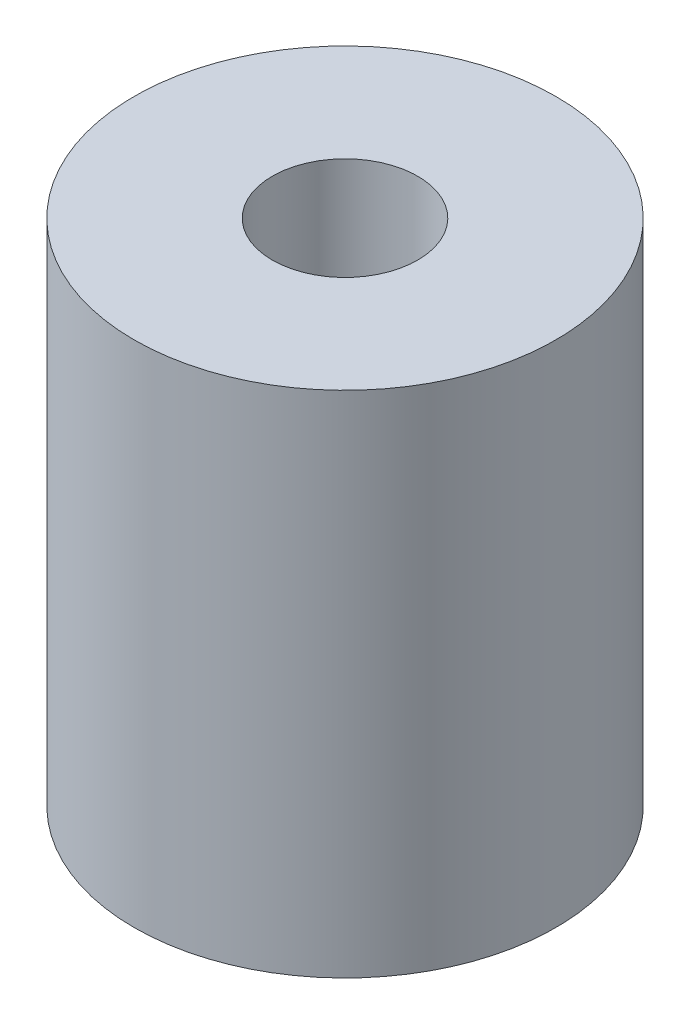
ISO-10303-21;
HEADER;
FILE_DESCRIPTION(('STEP AP214'),'2;1');
FILE_NAME('part.step','',(''),(''),'','','');
FILE_SCHEMA(('AUTOMOTIVE_DESIGN { 1 0 10303 214 1 1 1 1 }'));
ENDSEC;
DATA;
#1=APPLICATION_CONTEXT('core data for automotive mechanical design processes');
#2=APPLICATION_PROTOCOL_DEFINITION('international standard','automotive_design',2000,#1);
#3=PRODUCT_CONTEXT('',#1,'mechanical');
#4=PRODUCT('Part','Part','',(#3));
#5=PRODUCT_RELATED_PRODUCT_CATEGORY('part','',(#4));
#6=PRODUCT_DEFINITION_FORMATION('','',#4);
#7=PRODUCT_DEFINITION_CONTEXT('part definition',#1,'design');
#8=PRODUCT_DEFINITION('design','',#6,#7);
#9=PRODUCT_DEFINITION_SHAPE('','',#8);
#10=(LENGTH_UNIT() NAMED_UNIT(*) SI_UNIT(.MILLI.,.METRE.));
#11=(NAMED_UNIT(*) PLANE_ANGLE_UNIT() SI_UNIT($,.RADIAN.));
#12=(NAMED_UNIT(*) SI_UNIT($,.STERADIAN.) SOLID_ANGLE_UNIT());
#13=UNCERTAINTY_MEASURE_WITH_UNIT(LENGTH_MEASURE(1.E-05),#10,'distance_accuracy_value','');
#14=(GEOMETRIC_REPRESENTATION_CONTEXT(3) GLOBAL_UNCERTAINTY_ASSIGNED_CONTEXT((#13)) GLOBAL_UNIT_ASSIGNED_CONTEXT((#10,
#11,#12)) REPRESENTATION_CONTEXT('',''));
#15=CARTESIAN_POINT('',(0.,0.,0.));
#16=DIRECTION('',(0.,0.,1.));
#17=DIRECTION('',(1.,0.,0.));
#18=AXIS2_PLACEMENT_3D('',#15,#16,#17);
#19=CARTESIAN_POINT('',(0.,35.,0.));
#20=DIRECTION('',(0.,1.,0.));
#21=DIRECTION('',(0.,0.,1.));
#22=AXIS2_PLACEMENT_3D('',#19,#20,#21);
#23=PLANE('',#22);
#24=CARTESIAN_POINT('',(0.,35.,0.));
#25=DIRECTION('',(0.,1.,0.));
#26=DIRECTION('',(0.,0.,1.));
#27=AXIS2_PLACEMENT_3D('',#24,#25,#26);
#28=CIRCLE('',#27,14.5);
#29=CARTESIAN_POINT('',(0.,35.,14.5));
#30=VERTEX_POINT('',#29);
#31=EDGE_CURVE('E10',#30,#30,#28,.T.);
#32=ORIENTED_EDGE('',*,*,#31,.T.);
#33=EDGE_LOOP('',(#32));
#34=FACE_BOUND('',#33,.T.);
#35=CARTESIAN_POINT('',(0.,35.,0.));
#36=DIRECTION('',(0.,1.,0.));
#37=DIRECTION('',(0.,0.,1.));
#38=AXIS2_PLACEMENT_3D('',#35,#36,#37);
#39=CIRCLE('',#38,5.);
#40=CARTESIAN_POINT('',(0.,35.,5.));
#41=VERTEX_POINT('',#40);
#42=EDGE_CURVE('E54',#41,#41,#39,.T.);
#43=ORIENTED_EDGE('',*,*,#42,.F.);
#44=EDGE_LOOP('',(#43));
#45=FACE_BOUND('',#44,.T.);
#46=ADVANCED_FACE('F41',(#34,#45),#23,.T.);
#47=CARTESIAN_POINT('',(0.,0.,0.));
#48=DIRECTION('',(0.,1.,0.));
#49=DIRECTION('',(0.,0.,1.));
#50=AXIS2_PLACEMENT_3D('',#47,#48,#49);
#51=PLANE('',#50);
#52=CARTESIAN_POINT('',(0.,0.,0.));
#53=DIRECTION('',(0.,1.,0.));
#54=DIRECTION('',(0.,0.,1.));
#55=AXIS2_PLACEMENT_3D('',#52,#53,#54);
#56=CIRCLE('',#55,14.5);
#57=CARTESIAN_POINT('',(0.,0.,14.5));
#58=VERTEX_POINT('',#57);
#59=EDGE_CURVE('E45',#58,#58,#56,.T.);
#60=ORIENTED_EDGE('',*,*,#59,.F.);
#61=EDGE_LOOP('',(#60));
#62=FACE_BOUND('',#61,.T.);
#63=CARTESIAN_POINT('',(0.,0.,0.));
#64=DIRECTION('',(0.,1.,0.));
#65=DIRECTION('',(0.,0.,1.));
#66=AXIS2_PLACEMENT_3D('',#63,#64,#65);
#67=CIRCLE('',#66,5.);
#68=CARTESIAN_POINT('',(0.,0.,5.));
#69=VERTEX_POINT('',#68);
#70=EDGE_CURVE('E56',#69,#69,#67,.T.);
#71=ORIENTED_EDGE('',*,*,#70,.T.);
#72=EDGE_LOOP('',(#71));
#73=FACE_BOUND('',#72,.T.);
#74=ADVANCED_FACE('F68',(#62,#73),#51,.F.);
#75=CARTESIAN_POINT('',(0.,35.,0.));
#76=DIRECTION('',(0.,-1.,0.));
#77=DIRECTION('',(0.,0.,-1.));
#78=AXIS2_PLACEMENT_3D('',#75,#76,#77);
#79=CYLINDRICAL_SURFACE('',#78,14.5);
#80=ORIENTED_EDGE('',*,*,#31,.F.);
#81=EDGE_LOOP('',(#80));
#82=FACE_BOUND('',#81,.T.);
#83=ORIENTED_EDGE('',*,*,#59,.T.);
#84=EDGE_LOOP('',(#83));
#85=FACE_BOUND('',#84,.T.);
#86=ADVANCED_FACE('F43',(#82,#85),#79,.T.);
#87=CARTESIAN_POINT('',(0.,35.,0.));
#88=DIRECTION('',(0.,-1.,0.));
#89=DIRECTION('',(0.,0.,-1.));
#90=AXIS2_PLACEMENT_3D('',#87,#88,#89);
#91=CYLINDRICAL_SURFACE('',#90,5.);
#92=ORIENTED_EDGE('',*,*,#42,.T.);
#93=EDGE_LOOP('',(#92));
#94=FACE_BOUND('',#93,.T.);
#95=ORIENTED_EDGE('',*,*,#70,.F.);
#96=EDGE_LOOP('',(#95));
#97=FACE_BOUND('',#96,.T.);
#98=ADVANCED_FACE('F64',(#94,#97),#91,.F.);
#99=CLOSED_SHELL('',(#46,#74,#86,#98));
#100=MANIFOLD_SOLID_BREP('B2',#99);
#101=ADVANCED_BREP_SHAPE_REPRESENTATION('',(#18,#100),#14);
#102=SHAPE_DEFINITION_REPRESENTATION(#9,#101);
ENDSEC;
END-ISO-10303-21;
